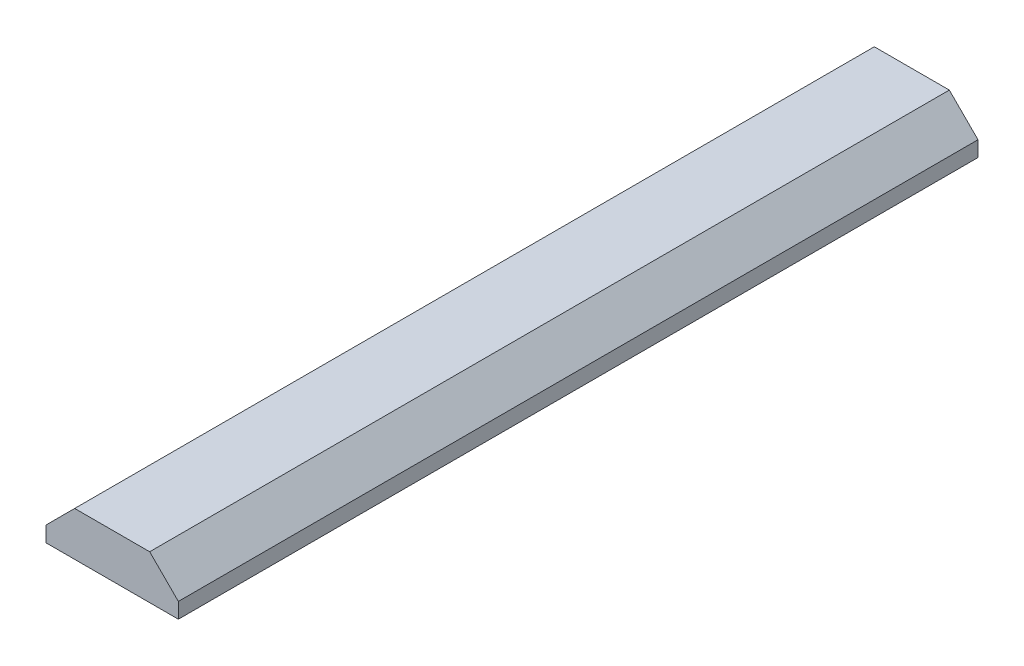
ISO-10303-21;
HEADER;
FILE_DESCRIPTION(('STEP AP214'),'2;1');
FILE_NAME('part.step','',(''),(''),'','','');
FILE_SCHEMA(('AUTOMOTIVE_DESIGN { 1 0 10303 214 1 1 1 1 }'));
ENDSEC;
DATA;
#1=APPLICATION_CONTEXT('core data for automotive mechanical design processes');
#2=APPLICATION_PROTOCOL_DEFINITION('international standard','automotive_design',2000,#1);
#3=PRODUCT_CONTEXT('',#1,'mechanical');
#4=PRODUCT('Part','Part','',(#3));
#5=PRODUCT_RELATED_PRODUCT_CATEGORY('part','',(#4));
#6=PRODUCT_DEFINITION_FORMATION('','',#4);
#7=PRODUCT_DEFINITION_CONTEXT('part definition',#1,'design');
#8=PRODUCT_DEFINITION('design','',#6,#7);
#9=PRODUCT_DEFINITION_SHAPE('','',#8);
#10=(LENGTH_UNIT() NAMED_UNIT(*) SI_UNIT(.MILLI.,.METRE.));
#11=(NAMED_UNIT(*) PLANE_ANGLE_UNIT() SI_UNIT($,.RADIAN.));
#12=(NAMED_UNIT(*) SI_UNIT($,.STERADIAN.) SOLID_ANGLE_UNIT());
#13=UNCERTAINTY_MEASURE_WITH_UNIT(LENGTH_MEASURE(1.E-05),#10,'distance_accuracy_value','');
#14=(GEOMETRIC_REPRESENTATION_CONTEXT(3) GLOBAL_UNCERTAINTY_ASSIGNED_CONTEXT((#13)) GLOBAL_UNIT_ASSIGNED_CONTEXT((#10,
#11,#12)) REPRESENTATION_CONTEXT('',''));
#15=CARTESIAN_POINT('',(0.,0.,0.));
#16=DIRECTION('',(0.,0.,1.));
#17=DIRECTION('',(1.,0.,0.));
#18=AXIS2_PLACEMENT_3D('',#15,#16,#17);
#19=CARTESIAN_POINT('',(3.4,1.80885878693797,72.5));
#20=DIRECTION('',(0.707106781186549,0.707106781186546,0.));
#21=DIRECTION('',(-0.707106781186546,0.707106781186549,0.));
#22=AXIS2_PLACEMENT_3D('',#19,#20,#21);
#23=PLANE('',#22);
#24=DIRECTION('',(0.707106781186546,-0.707106781186549,0.));
#25=VECTOR('',#24,1.);
#26=CARTESIAN_POINT('',(3.4,1.80885878693797,0.));
#27=LINE('',#26,#25);
#28=CARTESIAN_POINT('',(3.4,1.80885878693797,0.));
#29=VERTEX_POINT('',#28);
#30=CARTESIAN_POINT('',(6.,-0.791141213062042,0.));
#31=VERTEX_POINT('',#30);
#32=EDGE_CURVE('E139',#29,#31,#27,.T.);
#33=ORIENTED_EDGE('',*,*,#32,.F.);
#34=DIRECTION('',(0.,0.,-1.));
#35=VECTOR('',#34,1.);
#36=CARTESIAN_POINT('',(3.4,1.80885878693797,72.5));
#37=LINE('',#36,#35);
#38=CARTESIAN_POINT('',(3.4,1.80885878693797,72.5));
#39=VERTEX_POINT('',#38);
#40=EDGE_CURVE('E11',#39,#29,#37,.T.);
#41=ORIENTED_EDGE('',*,*,#40,.F.);
#42=DIRECTION('',(0.707106781186546,-0.707106781186549,0.));
#43=VECTOR('',#42,1.);
#44=CARTESIAN_POINT('',(3.4,1.80885878693797,72.5));
#45=LINE('',#44,#43);
#46=CARTESIAN_POINT('',(6.,-0.791141213062042,72.5));
#47=VERTEX_POINT('',#46);
#48=EDGE_CURVE('E157',#39,#47,#45,.T.);
#49=ORIENTED_EDGE('',*,*,#48,.T.);
#50=DIRECTION('',(0.,0.,-1.));
#51=VECTOR('',#50,1.);
#52=CARTESIAN_POINT('',(6.,-0.791141213062042,72.5));
#53=LINE('',#52,#51);
#54=EDGE_CURVE('E50',#47,#31,#53,.T.);
#55=ORIENTED_EDGE('',*,*,#54,.T.);
#56=EDGE_LOOP('',(#33,#41,#49,#55));
#57=FACE_BOUND('',#56,.T.);
#58=ADVANCED_FACE('F47',(#57),#23,.T.);
#59=CARTESIAN_POINT('',(3.4,1.80885878693797,72.5));
#60=DIRECTION('',(0.,-1.,0.));
#61=DIRECTION('',(0.,0.,-1.));
#62=AXIS2_PLACEMENT_3D('',#59,#60,#61);
#63=PLANE('',#62);
#64=DIRECTION('',(-1.,0.,0.));
#65=VECTOR('',#64,1.);
#66=CARTESIAN_POINT('',(3.4,1.80885878693797,0.));
#67=LINE('',#66,#65);
#68=CARTESIAN_POINT('',(-3.4,1.80885878693797,0.));
#69=VERTEX_POINT('',#68);
#70=EDGE_CURVE('E87',#29,#69,#67,.T.);
#71=ORIENTED_EDGE('',*,*,#70,.T.);
#72=DIRECTION('',(0.,0.,-1.));
#73=VECTOR('',#72,1.);
#74=CARTESIAN_POINT('',(-3.4,1.80885878693797,72.5));
#75=LINE('',#74,#73);
#76=CARTESIAN_POINT('',(-3.4,1.80885878693797,72.5));
#77=VERTEX_POINT('',#76);
#78=EDGE_CURVE('E57',#77,#69,#75,.T.);
#79=ORIENTED_EDGE('',*,*,#78,.F.);
#80=DIRECTION('',(-1.,0.,0.));
#81=VECTOR('',#80,1.);
#82=CARTESIAN_POINT('',(3.4,1.80885878693797,72.5));
#83=LINE('',#82,#81);
#84=EDGE_CURVE('E112',#39,#77,#83,.T.);
#85=ORIENTED_EDGE('',*,*,#84,.F.);
#86=ORIENTED_EDGE('',*,*,#40,.T.);
#87=EDGE_LOOP('',(#71,#79,#85,#86));
#88=FACE_BOUND('',#87,.T.);
#89=ADVANCED_FACE('F183',(#88),#63,.F.);
#90=CARTESIAN_POINT('',(-3.4,1.80885878693797,72.5));
#91=DIRECTION('',(0.707106781186549,-0.707106781186546,0.));
#92=DIRECTION('',(0.707106781186546,0.707106781186549,0.));
#93=AXIS2_PLACEMENT_3D('',#90,#91,#92);
#94=PLANE('',#93);
#95=DIRECTION('',(-0.707106781186546,-0.707106781186549,0.));
#96=VECTOR('',#95,1.);
#97=CARTESIAN_POINT('',(-3.4,1.80885878693797,0.));
#98=LINE('',#97,#96);
#99=CARTESIAN_POINT('',(-6.,-0.791141213062042,0.));
#100=VERTEX_POINT('',#99);
#101=EDGE_CURVE('E120',#69,#100,#98,.T.);
#102=ORIENTED_EDGE('',*,*,#101,.T.);
#103=DIRECTION('',(0.,0.,-1.));
#104=VECTOR('',#103,1.);
#105=CARTESIAN_POINT('',(-6.,-0.791141213062042,72.5));
#106=LINE('',#105,#104);
#107=CARTESIAN_POINT('',(-6.,-0.791141213062042,72.5));
#108=VERTEX_POINT('',#107);
#109=EDGE_CURVE('E117',#108,#100,#106,.T.);
#110=ORIENTED_EDGE('',*,*,#109,.F.);
#111=DIRECTION('',(-0.707106781186546,-0.707106781186549,0.));
#112=VECTOR('',#111,1.);
#113=CARTESIAN_POINT('',(-3.4,1.80885878693797,72.5));
#114=LINE('',#113,#112);
#115=EDGE_CURVE('E105',#77,#108,#114,.T.);
#116=ORIENTED_EDGE('',*,*,#115,.F.);
#117=ORIENTED_EDGE('',*,*,#78,.T.);
#118=EDGE_LOOP('',(#102,#110,#116,#117));
#119=FACE_BOUND('',#118,.T.);
#120=ADVANCED_FACE('F118',(#119),#94,.F.);
#121=CARTESIAN_POINT('',(-6.,-0.791141213062042,72.5));
#122=DIRECTION('',(1.,0.,0.));
#123=DIRECTION('',(0.,0.,-1.));
#124=AXIS2_PLACEMENT_3D('',#121,#122,#123);
#125=PLANE('',#124);
#126=DIRECTION('',(0.,-1.,0.));
#127=VECTOR('',#126,1.);
#128=CARTESIAN_POINT('',(-6.,-0.791141213062042,0.));
#129=LINE('',#128,#127);
#130=CARTESIAN_POINT('',(-6.,-2.19114121306203,0.));
#131=VERTEX_POINT('',#130);
#132=EDGE_CURVE('E151',#100,#131,#129,.T.);
#133=ORIENTED_EDGE('',*,*,#132,.T.);
#134=DIRECTION('',(0.,0.,-1.));
#135=VECTOR('',#134,1.);
#136=CARTESIAN_POINT('',(-6.,-2.19114121306203,72.5));
#137=LINE('',#136,#135);
#138=CARTESIAN_POINT('',(-6.,-2.19114121306203,72.5));
#139=VERTEX_POINT('',#138);
#140=EDGE_CURVE('E124',#139,#131,#137,.T.);
#141=ORIENTED_EDGE('',*,*,#140,.F.);
#142=DIRECTION('',(0.,-1.,0.));
#143=VECTOR('',#142,1.);
#144=CARTESIAN_POINT('',(-6.,-0.791141213062042,72.5));
#145=LINE('',#144,#143);
#146=EDGE_CURVE('E110',#108,#139,#145,.T.);
#147=ORIENTED_EDGE('',*,*,#146,.F.);
#148=ORIENTED_EDGE('',*,*,#109,.T.);
#149=EDGE_LOOP('',(#133,#141,#147,#148));
#150=FACE_BOUND('',#149,.T.);
#151=ADVANCED_FACE('F126',(#150),#125,.F.);
#152=CARTESIAN_POINT('',(-6.,-2.19114121306203,72.5));
#153=DIRECTION('',(0.,1.,0.));
#154=DIRECTION('',(0.,0.,1.));
#155=AXIS2_PLACEMENT_3D('',#152,#153,#154);
#156=PLANE('',#155);
#157=DIRECTION('',(1.,0.,0.));
#158=VECTOR('',#157,1.);
#159=CARTESIAN_POINT('',(-6.,-2.19114121306203,0.));
#160=LINE('',#159,#158);
#161=CARTESIAN_POINT('',(6.,-2.19114121306203,0.));
#162=VERTEX_POINT('',#161);
#163=EDGE_CURVE('E147',#131,#162,#160,.T.);
#164=ORIENTED_EDGE('',*,*,#163,.T.);
#165=DIRECTION('',(0.,0.,-1.));
#166=VECTOR('',#165,1.);
#167=CARTESIAN_POINT('',(6.,-2.19114121306203,72.5));
#168=LINE('',#167,#166);
#169=CARTESIAN_POINT('',(6.,-2.19114121306203,72.5));
#170=VERTEX_POINT('',#169);
#171=EDGE_CURVE('E162',#170,#162,#168,.T.);
#172=ORIENTED_EDGE('',*,*,#171,.F.);
#173=DIRECTION('',(1.,0.,0.));
#174=VECTOR('',#173,1.);
#175=CARTESIAN_POINT('',(-6.,-2.19114121306203,72.5));
#176=LINE('',#175,#174);
#177=EDGE_CURVE('E130',#139,#170,#176,.T.);
#178=ORIENTED_EDGE('',*,*,#177,.F.);
#179=ORIENTED_EDGE('',*,*,#140,.T.);
#180=EDGE_LOOP('',(#164,#172,#178,#179));
#181=FACE_BOUND('',#180,.T.);
#182=ADVANCED_FACE('F171',(#181),#156,.F.);
#183=CARTESIAN_POINT('',(6.,-0.791141213062042,72.5));
#184=DIRECTION('',(1.,0.,0.));
#185=DIRECTION('',(0.,0.,-1.));
#186=AXIS2_PLACEMENT_3D('',#183,#184,#185);
#187=PLANE('',#186);
#188=DIRECTION('',(0.,-1.,0.));
#189=VECTOR('',#188,1.);
#190=CARTESIAN_POINT('',(6.,-0.791141213062042,0.));
#191=LINE('',#190,#189);
#192=EDGE_CURVE('E143',#31,#162,#191,.T.);
#193=ORIENTED_EDGE('',*,*,#192,.F.);
#194=ORIENTED_EDGE('',*,*,#54,.F.);
#195=DIRECTION('',(0.,-1.,0.));
#196=VECTOR('',#195,1.);
#197=CARTESIAN_POINT('',(6.,-0.791141213062042,72.5));
#198=LINE('',#197,#196);
#199=EDGE_CURVE('E133',#47,#170,#198,.T.);
#200=ORIENTED_EDGE('',*,*,#199,.T.);
#201=ORIENTED_EDGE('',*,*,#171,.T.);
#202=EDGE_LOOP('',(#193,#194,#200,#201));
#203=FACE_BOUND('',#202,.T.);
#204=ADVANCED_FACE('F166',(#203),#187,.T.);
#205=CARTESIAN_POINT('',(0.,0.,72.5));
#206=DIRECTION('',(0.,0.,-1.));
#207=DIRECTION('',(-1.,0.,0.));
#208=AXIS2_PLACEMENT_3D('',#205,#206,#207);
#209=PLANE('',#208);
#210=ORIENTED_EDGE('',*,*,#48,.F.);
#211=ORIENTED_EDGE('',*,*,#84,.T.);
#212=ORIENTED_EDGE('',*,*,#115,.T.);
#213=ORIENTED_EDGE('',*,*,#146,.T.);
#214=ORIENTED_EDGE('',*,*,#177,.T.);
#215=ORIENTED_EDGE('',*,*,#199,.F.);
#216=EDGE_LOOP('',(#210,#211,#212,#213,#214,#215));
#217=FACE_BOUND('',#216,.T.);
#218=ADVANCED_FACE('F108',(#217),#209,.F.);
#219=CARTESIAN_POINT('',(0.,0.,0.));
#220=DIRECTION('',(0.,0.,-1.));
#221=DIRECTION('',(-1.,0.,0.));
#222=AXIS2_PLACEMENT_3D('',#219,#220,#221);
#223=PLANE('',#222);
#224=ORIENTED_EDGE('',*,*,#32,.T.);
#225=ORIENTED_EDGE('',*,*,#192,.T.);
#226=ORIENTED_EDGE('',*,*,#163,.F.);
#227=ORIENTED_EDGE('',*,*,#132,.F.);
#228=ORIENTED_EDGE('',*,*,#101,.F.);
#229=ORIENTED_EDGE('',*,*,#70,.F.);
#230=EDGE_LOOP('',(#224,#225,#226,#227,#228,#229));
#231=FACE_BOUND('',#230,.T.);
#232=ADVANCED_FACE('F169',(#231),#223,.T.);
#233=CLOSED_SHELL('',(#58,#89,#120,#151,#182,#204,#218,#232));
#234=MANIFOLD_SOLID_BREP('B2',#233);
#235=ADVANCED_BREP_SHAPE_REPRESENTATION('',(#18,#234),#14);
#236=SHAPE_DEFINITION_REPRESENTATION(#9,#235);
ENDSEC;
END-ISO-10303-21;
